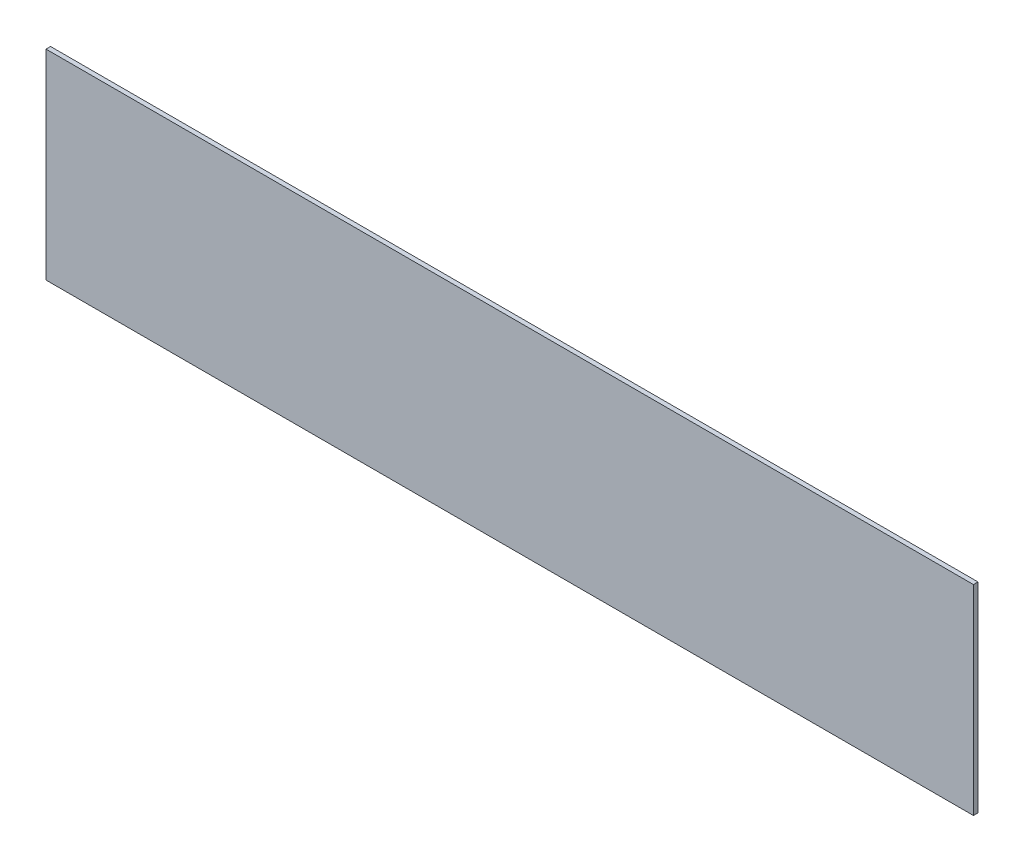
ISO-10303-21;
HEADER;
FILE_DESCRIPTION(('STEP AP214'),'2;1');
FILE_NAME('part.step','',(''),(''),'','','');
FILE_SCHEMA(('AUTOMOTIVE_DESIGN { 1 0 10303 214 1 1 1 1 }'));
ENDSEC;
DATA;
#1=APPLICATION_CONTEXT('core data for automotive mechanical design processes');
#2=APPLICATION_PROTOCOL_DEFINITION('international standard','automotive_design',2000,#1);
#3=PRODUCT_CONTEXT('',#1,'mechanical');
#4=PRODUCT('Part','Part','',(#3));
#5=PRODUCT_RELATED_PRODUCT_CATEGORY('part','',(#4));
#6=PRODUCT_DEFINITION_FORMATION('','',#4);
#7=PRODUCT_DEFINITION_CONTEXT('part definition',#1,'design');
#8=PRODUCT_DEFINITION('design','',#6,#7);
#9=PRODUCT_DEFINITION_SHAPE('','',#8);
#10=(LENGTH_UNIT() NAMED_UNIT(*) SI_UNIT(.MILLI.,.METRE.));
#11=(NAMED_UNIT(*) PLANE_ANGLE_UNIT() SI_UNIT($,.RADIAN.));
#12=(NAMED_UNIT(*) SI_UNIT($,.STERADIAN.) SOLID_ANGLE_UNIT());
#13=UNCERTAINTY_MEASURE_WITH_UNIT(LENGTH_MEASURE(1.E-05),#10,'distance_accuracy_value','');
#14=(GEOMETRIC_REPRESENTATION_CONTEXT(3) GLOBAL_UNCERTAINTY_ASSIGNED_CONTEXT((#13)) GLOBAL_UNIT_ASSIGNED_CONTEXT((#10,
#11,#12)) REPRESENTATION_CONTEXT('',''));
#15=CARTESIAN_POINT('',(0.,0.,0.));
#16=DIRECTION('',(0.,0.,1.));
#17=DIRECTION('',(1.,0.,0.));
#18=AXIS2_PLACEMENT_3D('',#15,#16,#17);
#19=CARTESIAN_POINT('',(1020.,-220.,10.));
#20=DIRECTION('',(-1.,0.,0.));
#21=DIRECTION('',(0.,0.,1.));
#22=AXIS2_PLACEMENT_3D('',#19,#20,#21);
#23=PLANE('',#22);
#24=DIRECTION('',(0.,1.,0.));
#25=VECTOR('',#24,1.);
#26=CARTESIAN_POINT('',(1020.,-220.,0.));
#27=LINE('',#26,#25);
#28=CARTESIAN_POINT('',(1020.,-220.,0.));
#29=VERTEX_POINT('',#28);
#30=CARTESIAN_POINT('',(1020.,220.,0.));
#31=VERTEX_POINT('',#30);
#32=EDGE_CURVE('E102',#29,#31,#27,.T.);
#33=ORIENTED_EDGE('',*,*,#32,.T.);
#34=DIRECTION('',(0.,0.,-1.));
#35=VECTOR('',#34,1.);
#36=CARTESIAN_POINT('',(1020.,220.,10.));
#37=LINE('',#36,#35);
#38=CARTESIAN_POINT('',(1020.,220.,10.));
#39=VERTEX_POINT('',#38);
#40=EDGE_CURVE('E11',#39,#31,#37,.T.);
#41=ORIENTED_EDGE('',*,*,#40,.F.);
#42=DIRECTION('',(0.,1.,0.));
#43=VECTOR('',#42,1.);
#44=CARTESIAN_POINT('',(1020.,-220.,10.));
#45=LINE('',#44,#43);
#46=CARTESIAN_POINT('',(1020.,-220.,10.));
#47=VERTEX_POINT('',#46);
#48=EDGE_CURVE('E90',#47,#39,#45,.T.);
#49=ORIENTED_EDGE('',*,*,#48,.F.);
#50=DIRECTION('',(0.,0.,-1.));
#51=VECTOR('',#50,1.);
#52=CARTESIAN_POINT('',(1020.,-220.,10.));
#53=LINE('',#52,#51);
#54=EDGE_CURVE('E98',#47,#29,#53,.T.);
#55=ORIENTED_EDGE('',*,*,#54,.T.);
#56=EDGE_LOOP('',(#33,#41,#49,#55));
#57=FACE_BOUND('',#56,.T.);
#58=ADVANCED_FACE('F39',(#57),#23,.F.);
#59=CARTESIAN_POINT('',(-1020.,220.,10.));
#60=DIRECTION('',(0.,-1.,0.));
#61=DIRECTION('',(0.,0.,-1.));
#62=AXIS2_PLACEMENT_3D('',#59,#60,#61);
#63=PLANE('',#62);
#64=DIRECTION('',(-1.,0.,0.));
#65=VECTOR('',#64,1.);
#66=CARTESIAN_POINT('',(-1020.,220.,0.));
#67=LINE('',#66,#65);
#68=CARTESIAN_POINT('',(-1020.,220.,0.));
#69=VERTEX_POINT('',#68);
#70=EDGE_CURVE('E94',#31,#69,#67,.T.);
#71=ORIENTED_EDGE('',*,*,#70,.T.);
#72=DIRECTION('',(0.,0.,-1.));
#73=VECTOR('',#72,1.);
#74=CARTESIAN_POINT('',(-1020.,220.,10.));
#75=LINE('',#74,#73);
#76=CARTESIAN_POINT('',(-1020.,220.,10.));
#77=VERTEX_POINT('',#76);
#78=EDGE_CURVE('E47',#77,#69,#75,.T.);
#79=ORIENTED_EDGE('',*,*,#78,.F.);
#80=DIRECTION('',(-1.,0.,0.));
#81=VECTOR('',#80,1.);
#82=CARTESIAN_POINT('',(-1020.,220.,10.));
#83=LINE('',#82,#81);
#84=EDGE_CURVE('E85',#39,#77,#83,.T.);
#85=ORIENTED_EDGE('',*,*,#84,.F.);
#86=ORIENTED_EDGE('',*,*,#40,.T.);
#87=EDGE_LOOP('',(#71,#79,#85,#86));
#88=FACE_BOUND('',#87,.T.);
#89=ADVANCED_FACE('F93',(#88),#63,.F.);
#90=CARTESIAN_POINT('',(-1020.,-220.,10.));
#91=DIRECTION('',(1.,0.,0.));
#92=DIRECTION('',(0.,0.,-1.));
#93=AXIS2_PLACEMENT_3D('',#90,#91,#92);
#94=PLANE('',#93);
#95=DIRECTION('',(0.,-1.,0.));
#96=VECTOR('',#95,1.);
#97=CARTESIAN_POINT('',(-1020.,-220.,0.));
#98=LINE('',#97,#96);
#99=CARTESIAN_POINT('',(-1020.,-220.,0.));
#100=VERTEX_POINT('',#99);
#101=EDGE_CURVE('E72',#69,#100,#98,.T.);
#102=ORIENTED_EDGE('',*,*,#101,.T.);
#103=DIRECTION('',(0.,0.,-1.));
#104=VECTOR('',#103,1.);
#105=CARTESIAN_POINT('',(-1020.,-220.,10.));
#106=LINE('',#105,#104);
#107=CARTESIAN_POINT('',(-1020.,-220.,10.));
#108=VERTEX_POINT('',#107);
#109=EDGE_CURVE('E95',#108,#100,#106,.T.);
#110=ORIENTED_EDGE('',*,*,#109,.F.);
#111=DIRECTION('',(0.,-1.,0.));
#112=VECTOR('',#111,1.);
#113=CARTESIAN_POINT('',(-1020.,-220.,10.));
#114=LINE('',#113,#112);
#115=EDGE_CURVE('E88',#77,#108,#114,.T.);
#116=ORIENTED_EDGE('',*,*,#115,.F.);
#117=ORIENTED_EDGE('',*,*,#78,.T.);
#118=EDGE_LOOP('',(#102,#110,#116,#117));
#119=FACE_BOUND('',#118,.T.);
#120=ADVANCED_FACE('F96',(#119),#94,.F.);
#121=CARTESIAN_POINT('',(-1020.,-220.,10.));
#122=DIRECTION('',(0.,1.,0.));
#123=DIRECTION('',(0.,0.,1.));
#124=AXIS2_PLACEMENT_3D('',#121,#122,#123);
#125=PLANE('',#124);
#126=DIRECTION('',(1.,0.,0.));
#127=VECTOR('',#126,1.);
#128=CARTESIAN_POINT('',(-1020.,-220.,0.));
#129=LINE('',#128,#127);
#130=EDGE_CURVE('E78',#100,#29,#129,.T.);
#131=ORIENTED_EDGE('',*,*,#130,.T.);
#132=ORIENTED_EDGE('',*,*,#54,.F.);
#133=DIRECTION('',(1.,0.,0.));
#134=VECTOR('',#133,1.);
#135=CARTESIAN_POINT('',(-1020.,-220.,10.));
#136=LINE('',#135,#134);
#137=EDGE_CURVE('E55',#108,#47,#136,.T.);
#138=ORIENTED_EDGE('',*,*,#137,.F.);
#139=ORIENTED_EDGE('',*,*,#109,.T.);
#140=EDGE_LOOP('',(#131,#132,#138,#139));
#141=FACE_BOUND('',#140,.T.);
#142=ADVANCED_FACE('F109',(#141),#125,.F.);
#143=CARTESIAN_POINT('',(0.,0.,10.));
#144=DIRECTION('',(0.,0.,-1.));
#145=DIRECTION('',(-1.,0.,0.));
#146=AXIS2_PLACEMENT_3D('',#143,#144,#145);
#147=PLANE('',#146);
#148=ORIENTED_EDGE('',*,*,#48,.T.);
#149=ORIENTED_EDGE('',*,*,#84,.T.);
#150=ORIENTED_EDGE('',*,*,#115,.T.);
#151=ORIENTED_EDGE('',*,*,#137,.T.);
#152=EDGE_LOOP('',(#148,#149,#150,#151));
#153=FACE_BOUND('',#152,.T.);
#154=ADVANCED_FACE('F86',(#153),#147,.F.);
#155=CARTESIAN_POINT('',(0.,0.,0.));
#156=DIRECTION('',(0.,0.,-1.));
#157=DIRECTION('',(-1.,0.,0.));
#158=AXIS2_PLACEMENT_3D('',#155,#156,#157);
#159=PLANE('',#158);
#160=ORIENTED_EDGE('',*,*,#32,.F.);
#161=ORIENTED_EDGE('',*,*,#130,.F.);
#162=ORIENTED_EDGE('',*,*,#101,.F.);
#163=ORIENTED_EDGE('',*,*,#70,.F.);
#164=EDGE_LOOP('',(#160,#161,#162,#163));
#165=FACE_BOUND('',#164,.T.);
#166=ADVANCED_FACE('F112',(#165),#159,.T.);
#167=CLOSED_SHELL('',(#58,#89,#120,#142,#154,#166));
#168=MANIFOLD_SOLID_BREP('B2',#167);
#169=ADVANCED_BREP_SHAPE_REPRESENTATION('',(#18,#168),#14);
#170=SHAPE_DEFINITION_REPRESENTATION(#9,#169);
ENDSEC;
END-ISO-10303-21;
